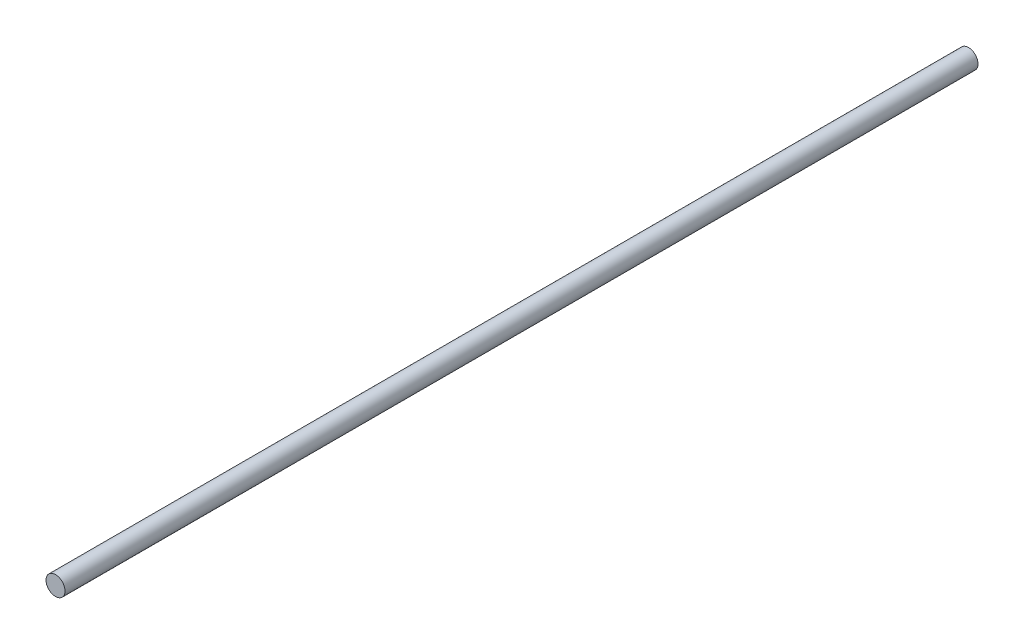
ISO-10303-21;
HEADER;
FILE_DESCRIPTION(('STEP AP214'),'2;1');
FILE_NAME('part.step','',(''),(''),'','','');
FILE_SCHEMA(('AUTOMOTIVE_DESIGN { 1 0 10303 214 1 1 1 1 }'));
ENDSEC;
DATA;
#1=APPLICATION_CONTEXT('core data for automotive mechanical design processes');
#2=APPLICATION_PROTOCOL_DEFINITION('international standard','automotive_design',2000,#1);
#3=PRODUCT_CONTEXT('',#1,'mechanical');
#4=PRODUCT('Part','Part','',(#3));
#5=PRODUCT_RELATED_PRODUCT_CATEGORY('part','',(#4));
#6=PRODUCT_DEFINITION_FORMATION('','',#4);
#7=PRODUCT_DEFINITION_CONTEXT('part definition',#1,'design');
#8=PRODUCT_DEFINITION('design','',#6,#7);
#9=PRODUCT_DEFINITION_SHAPE('','',#8);
#10=(LENGTH_UNIT() NAMED_UNIT(*) SI_UNIT(.MILLI.,.METRE.));
#11=(NAMED_UNIT(*) PLANE_ANGLE_UNIT() SI_UNIT($,.RADIAN.));
#12=(NAMED_UNIT(*) SI_UNIT($,.STERADIAN.) SOLID_ANGLE_UNIT());
#13=UNCERTAINTY_MEASURE_WITH_UNIT(LENGTH_MEASURE(1.E-05),#10,'distance_accuracy_value','');
#14=(GEOMETRIC_REPRESENTATION_CONTEXT(3) GLOBAL_UNCERTAINTY_ASSIGNED_CONTEXT((#13)) GLOBAL_UNIT_ASSIGNED_CONTEXT((#10,
#11,#12)) REPRESENTATION_CONTEXT('',''));
#15=CARTESIAN_POINT('',(0.,0.,0.));
#16=DIRECTION('',(0.,0.,1.));
#17=DIRECTION('',(1.,0.,0.));
#18=AXIS2_PLACEMENT_3D('',#15,#16,#17);
#19=CARTESIAN_POINT('',(0.,0.,304.8));
#20=DIRECTION('',(0.,0.,-1.));
#21=DIRECTION('',(-1.,0.,0.));
#22=AXIS2_PLACEMENT_3D('',#19,#20,#21);
#23=CYLINDRICAL_SURFACE('',#22,3.175);
#24=CARTESIAN_POINT('',(0.,0.,304.8));
#25=DIRECTION('',(0.,0.,1.));
#26=DIRECTION('',(1.,0.,0.));
#27=AXIS2_PLACEMENT_3D('',#24,#25,#26);
#28=CIRCLE('',#27,3.175);
#29=CARTESIAN_POINT('',(-3.175,0.,304.8));
#30=VERTEX_POINT('',#29);
#31=EDGE_CURVE('E12',#30,#30,#28,.T.);
#32=CARTESIAN_POINT('',(0.,0.,0.));
#33=DIRECTION('',(0.,0.,1.));
#34=DIRECTION('',(1.,0.,0.));
#35=AXIS2_PLACEMENT_3D('',#32,#33,#34);
#36=CIRCLE('',#35,3.175);
#37=CARTESIAN_POINT('',(-3.175,0.,0.));
#38=VERTEX_POINT('',#37);
#39=EDGE_CURVE('E53',#38,#38,#36,.T.);
#40=CARTESIAN_POINT('',(-3.175,0.,304.8));
#41=CARTESIAN_POINT('',(-3.175,0.,301.625));
#42=CARTESIAN_POINT('',(-3.175,0.,298.45));
#43=CARTESIAN_POINT('',(-3.175,0.,292.1));
#44=CARTESIAN_POINT('',(-3.175,0.,288.925));
#45=CARTESIAN_POINT('',(-3.175,0.,282.575));
#46=CARTESIAN_POINT('',(-3.175,0.,279.4));
#47=CARTESIAN_POINT('',(-3.175,0.,273.05));
#48=CARTESIAN_POINT('',(-3.175,0.,269.875));
#49=CARTESIAN_POINT('',(-3.175,0.,263.525));
#50=CARTESIAN_POINT('',(-3.175,0.,260.35));
#51=CARTESIAN_POINT('',(-3.175,0.,254.));
#52=CARTESIAN_POINT('',(-3.175,0.,250.825));
#53=CARTESIAN_POINT('',(-3.175,0.,244.475));
#54=CARTESIAN_POINT('',(-3.175,0.,241.3));
#55=CARTESIAN_POINT('',(-3.175,0.,234.95));
#56=CARTESIAN_POINT('',(-3.175,0.,231.775));
#57=CARTESIAN_POINT('',(-3.175,0.,225.425));
#58=CARTESIAN_POINT('',(-3.175,0.,222.25));
#59=CARTESIAN_POINT('',(-3.175,0.,215.9));
#60=CARTESIAN_POINT('',(-3.175,0.,212.725));
#61=CARTESIAN_POINT('',(-3.175,0.,206.375));
#62=CARTESIAN_POINT('',(-3.175,0.,203.2));
#63=CARTESIAN_POINT('',(-3.175,0.,196.85));
#64=CARTESIAN_POINT('',(-3.175,0.,193.675));
#65=CARTESIAN_POINT('',(-3.175,0.,187.325));
#66=CARTESIAN_POINT('',(-3.175,0.,184.15));
#67=CARTESIAN_POINT('',(-3.175,0.,177.8));
#68=CARTESIAN_POINT('',(-3.175,0.,174.625));
#69=CARTESIAN_POINT('',(-3.175,0.,168.275));
#70=CARTESIAN_POINT('',(-3.175,0.,165.1));
#71=CARTESIAN_POINT('',(-3.175,0.,158.75));
#72=CARTESIAN_POINT('',(-3.175,0.,155.575));
#73=CARTESIAN_POINT('',(-3.175,0.,149.225));
#74=CARTESIAN_POINT('',(-3.175,0.,146.05));
#75=CARTESIAN_POINT('',(-3.175,0.,139.7));
#76=CARTESIAN_POINT('',(-3.175,0.,136.525));
#77=CARTESIAN_POINT('',(-3.175,0.,130.175));
#78=CARTESIAN_POINT('',(-3.175,0.,127.));
#79=CARTESIAN_POINT('',(-3.175,0.,120.65));
#80=CARTESIAN_POINT('',(-3.175,0.,117.475));
#81=CARTESIAN_POINT('',(-3.175,0.,111.125));
#82=CARTESIAN_POINT('',(-3.175,0.,107.95));
#83=CARTESIAN_POINT('',(-3.175,0.,101.6));
#84=CARTESIAN_POINT('',(-3.175,0.,98.425));
#85=CARTESIAN_POINT('',(-3.175,0.,92.075));
#86=CARTESIAN_POINT('',(-3.175,0.,88.9));
#87=CARTESIAN_POINT('',(-3.175,0.,82.55));
#88=CARTESIAN_POINT('',(-3.175,0.,79.375));
#89=CARTESIAN_POINT('',(-3.175,0.,73.025));
#90=CARTESIAN_POINT('',(-3.175,0.,69.85));
#91=CARTESIAN_POINT('',(-3.175,0.,63.5));
#92=CARTESIAN_POINT('',(-3.175,0.,60.325));
#93=CARTESIAN_POINT('',(-3.175,0.,53.975));
#94=CARTESIAN_POINT('',(-3.175,0.,50.8));
#95=CARTESIAN_POINT('',(-3.175,0.,44.45));
#96=CARTESIAN_POINT('',(-3.175,0.,41.275));
#97=CARTESIAN_POINT('',(-3.175,0.,34.925));
#98=CARTESIAN_POINT('',(-3.175,0.,31.75));
#99=CARTESIAN_POINT('',(-3.175,0.,25.4));
#100=CARTESIAN_POINT('',(-3.175,0.,22.225));
#101=CARTESIAN_POINT('',(-3.175,0.,15.875));
#102=CARTESIAN_POINT('',(-3.175,0.,12.7));
#103=CARTESIAN_POINT('',(-3.175,0.,6.35));
#104=CARTESIAN_POINT('',(-3.175,0.,3.175));
#105=CARTESIAN_POINT('',(-3.175,0.,0.));
#106=B_SPLINE_CURVE_WITH_KNOTS('',3,(#40,#41,#42,#43,#44,#45,#46,#47,#48,#49,#50,#51,#52,#53,
#54,#55,#56,#57,#58,#59,#60,#61,#62,#63,#64,#65,#66,#67,#68,#69,#70,#71,#72,#73,#74,#75,#76,#77,
#78,#79,#80,#81,#82,#83,#84,#85,#86,#87,#88,#89,#90,#91,#92,#93,#94,#95,#96,#97,#98,#99,#100,
#101,#102,#103,#104,#105),.UNSPECIFIED.,.F.,.F.,(4,2,2,2,2,2,2,2,2,2,2,2,2,2,2,2,2,2,2,2,2,2,2,
2,2,2,2,2,2,2,2,2,4),(0.,9.52499999999995,19.05,28.575,38.1,47.625,57.15,66.675,76.2,85.725,
95.2499999999999,104.775,114.3,123.825,133.35,142.875,152.4,161.925,171.45,180.975,190.5,
200.025,209.55,219.075,228.6,238.125,247.65,257.175,266.7,276.225,285.75,295.275,304.8),.UNSPECIFIED.);
#107=EDGE_CURVE('BSEAM50',#30,#38,#106,.T.);
#108=ORIENTED_EDGE('',*,*,#31,.F.);
#109=ORIENTED_EDGE('',*,*,#39,.T.);
#110=ORIENTED_EDGE('',*,*,#107,.T.);
#111=ORIENTED_EDGE('',*,*,#107,.F.);
#112=EDGE_LOOP('',(#108,#110,#109,#111));
#113=FACE_BOUND('',#112,.T.);
#114=ADVANCED_FACE('F50',(#113),#23,.T.);
#115=CARTESIAN_POINT('',(0.,0.,304.8));
#116=DIRECTION('',(0.,0.,1.));
#117=DIRECTION('',(1.,0.,0.));
#118=AXIS2_PLACEMENT_3D('',#115,#116,#117);
#119=PLANE('',#118);
#120=ORIENTED_EDGE('',*,*,#31,.T.);
#121=EDGE_LOOP('',(#120));
#122=FACE_BOUND('',#121,.T.);
#123=ADVANCED_FACE('F69',(#122),#119,.T.);
#124=CARTESIAN_POINT('',(0.,0.,0.));
#125=DIRECTION('',(0.,0.,1.));
#126=DIRECTION('',(1.,0.,0.));
#127=AXIS2_PLACEMENT_3D('',#124,#125,#126);
#128=PLANE('',#127);
#129=ORIENTED_EDGE('',*,*,#39,.F.);
#130=EDGE_LOOP('',(#129));
#131=FACE_BOUND('',#130,.T.);
#132=ADVANCED_FACE('F67',(#131),#128,.F.);
#133=CLOSED_SHELL('',(#114,#123,#132));
#134=MANIFOLD_SOLID_BREP('B2',#133);
#135=ADVANCED_BREP_SHAPE_REPRESENTATION('',(#18,#134),#14);
#136=SHAPE_DEFINITION_REPRESENTATION(#9,#135);
ENDSEC;
END-ISO-10303-21;
